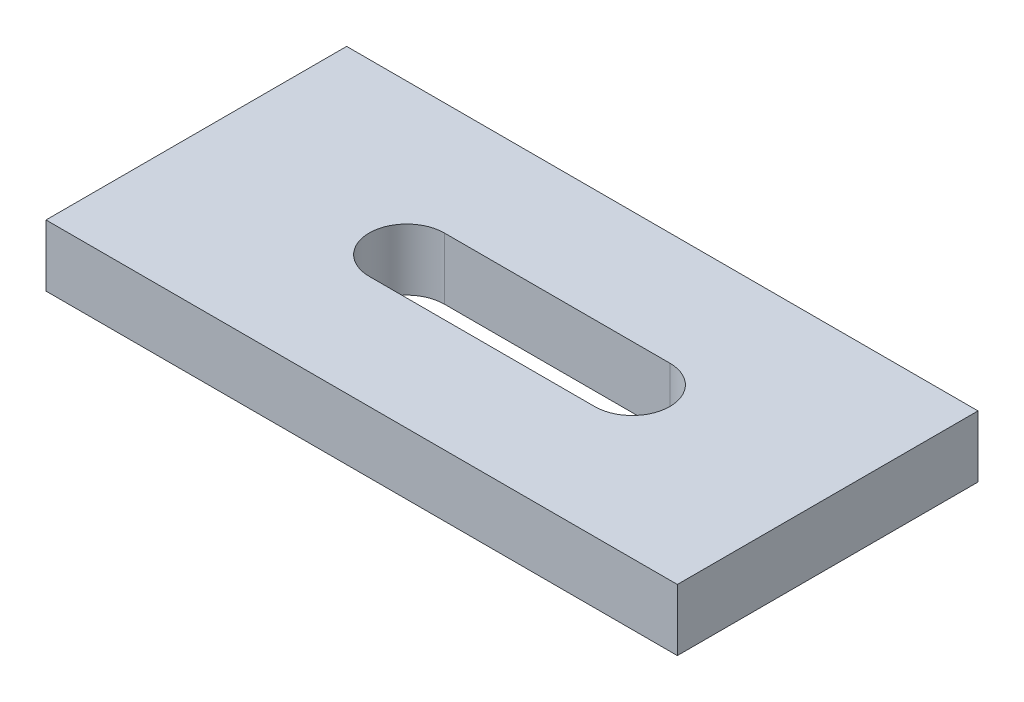
ISO-10303-21;
HEADER;
FILE_DESCRIPTION(('STEP AP214'),'2;1');
FILE_NAME('part.step','',(''),(''),'','','');
FILE_SCHEMA(('AUTOMOTIVE_DESIGN { 1 0 10303 214 1 1 1 1 }'));
ENDSEC;
DATA;
#1=APPLICATION_CONTEXT('core data for automotive mechanical design processes');
#2=APPLICATION_PROTOCOL_DEFINITION('international standard','automotive_design',2000,#1);
#3=PRODUCT_CONTEXT('',#1,'mechanical');
#4=PRODUCT('Part','Part','',(#3));
#5=PRODUCT_RELATED_PRODUCT_CATEGORY('part','',(#4));
#6=PRODUCT_DEFINITION_FORMATION('','',#4);
#7=PRODUCT_DEFINITION_CONTEXT('part definition',#1,'design');
#8=PRODUCT_DEFINITION('design','',#6,#7);
#9=PRODUCT_DEFINITION_SHAPE('','',#8);
#10=(LENGTH_UNIT() NAMED_UNIT(*) SI_UNIT(.MILLI.,.METRE.));
#11=(NAMED_UNIT(*) PLANE_ANGLE_UNIT() SI_UNIT($,.RADIAN.));
#12=(NAMED_UNIT(*) SI_UNIT($,.STERADIAN.) SOLID_ANGLE_UNIT());
#13=UNCERTAINTY_MEASURE_WITH_UNIT(LENGTH_MEASURE(1.E-05),#10,'distance_accuracy_value','');
#14=(GEOMETRIC_REPRESENTATION_CONTEXT(3) GLOBAL_UNCERTAINTY_ASSIGNED_CONTEXT((#13)) GLOBAL_UNIT_ASSIGNED_CONTEXT((#10,
#11,#12)) REPRESENTATION_CONTEXT('',''));
#15=CARTESIAN_POINT('',(0.,0.,0.));
#16=DIRECTION('',(0.,0.,1.));
#17=DIRECTION('',(1.,0.,0.));
#18=AXIS2_PLACEMENT_3D('',#15,#16,#17);
#19=CARTESIAN_POINT('',(0.,4.1,0.));
#20=DIRECTION('',(1.,0.,0.));
#21=DIRECTION('',(0.,0.,-1.));
#22=AXIS2_PLACEMENT_3D('',#19,#20,#21);
#23=PLANE('',#22);
#24=DIRECTION('',(0.,0.,1.));
#25=VECTOR('',#24,1.);
#26=CARTESIAN_POINT('',(0.,0.,0.));
#27=LINE('',#26,#25);
#28=CARTESIAN_POINT('',(0.,0.,-20.));
#29=VERTEX_POINT('',#28);
#30=CARTESIAN_POINT('',(0.,0.,0.));
#31=VERTEX_POINT('',#30);
#32=EDGE_CURVE('E126',#29,#31,#27,.T.);
#33=ORIENTED_EDGE('',*,*,#32,.T.);
#34=DIRECTION('',(0.,-1.,0.));
#35=VECTOR('',#34,1.);
#36=CARTESIAN_POINT('',(0.,4.1,0.));
#37=LINE('',#36,#35);
#38=CARTESIAN_POINT('',(0.,4.1,0.));
#39=VERTEX_POINT('',#38);
#40=EDGE_CURVE('E155',#39,#31,#37,.T.);
#41=ORIENTED_EDGE('',*,*,#40,.F.);
#42=DIRECTION('',(0.,0.,1.));
#43=VECTOR('',#42,1.);
#44=CARTESIAN_POINT('',(0.,4.1,0.));
#45=LINE('',#44,#43);
#46=CARTESIAN_POINT('',(0.,4.1,-20.));
#47=VERTEX_POINT('',#46);
#48=EDGE_CURVE('E129',#47,#39,#45,.T.);
#49=ORIENTED_EDGE('',*,*,#48,.F.);
#50=DIRECTION('',(0.,-1.,0.));
#51=VECTOR('',#50,1.);
#52=CARTESIAN_POINT('',(0.,4.1,-20.));
#53=LINE('',#52,#51);
#54=EDGE_CURVE('E139',#47,#29,#53,.T.);
#55=ORIENTED_EDGE('',*,*,#54,.T.);
#56=EDGE_LOOP('',(#33,#41,#49,#55));
#57=FACE_BOUND('',#56,.T.);
#58=ADVANCED_FACE('F37',(#57),#23,.F.);
#59=CARTESIAN_POINT('',(0.,4.1,0.));
#60=DIRECTION('',(0.,0.,-1.));
#61=DIRECTION('',(-1.,0.,0.));
#62=AXIS2_PLACEMENT_3D('',#59,#60,#61);
#63=PLANE('',#62);
#64=DIRECTION('',(1.,0.,0.));
#65=VECTOR('',#64,1.);
#66=CARTESIAN_POINT('',(0.,0.,0.));
#67=LINE('',#66,#65);
#68=CARTESIAN_POINT('',(42.,0.,0.));
#69=VERTEX_POINT('',#68);
#70=EDGE_CURVE('E142',#31,#69,#67,.T.);
#71=ORIENTED_EDGE('',*,*,#70,.T.);
#72=DIRECTION('',(0.,-1.,0.));
#73=VECTOR('',#72,1.);
#74=CARTESIAN_POINT('',(42.,4.1,0.));
#75=LINE('',#74,#73);
#76=CARTESIAN_POINT('',(42.,4.1,0.));
#77=VERTEX_POINT('',#76);
#78=EDGE_CURVE('E152',#77,#69,#75,.T.);
#79=ORIENTED_EDGE('',*,*,#78,.F.);
#80=DIRECTION('',(1.,0.,0.));
#81=VECTOR('',#80,1.);
#82=CARTESIAN_POINT('',(0.,4.1,0.));
#83=LINE('',#82,#81);
#84=EDGE_CURVE('E132',#39,#77,#83,.T.);
#85=ORIENTED_EDGE('',*,*,#84,.F.);
#86=ORIENTED_EDGE('',*,*,#40,.T.);
#87=EDGE_LOOP('',(#71,#79,#85,#86));
#88=FACE_BOUND('',#87,.T.);
#89=ADVANCED_FACE('F180',(#88),#63,.F.);
#90=CARTESIAN_POINT('',(42.,4.1,0.));
#91=DIRECTION('',(-1.,0.,0.));
#92=DIRECTION('',(0.,0.,1.));
#93=AXIS2_PLACEMENT_3D('',#90,#91,#92);
#94=PLANE('',#93);
#95=DIRECTION('',(0.,0.,-1.));
#96=VECTOR('',#95,1.);
#97=CARTESIAN_POINT('',(42.,0.,0.));
#98=LINE('',#97,#96);
#99=CARTESIAN_POINT('',(42.,0.,-20.));
#100=VERTEX_POINT('',#99);
#101=EDGE_CURVE('E144',#69,#100,#98,.T.);
#102=ORIENTED_EDGE('',*,*,#101,.T.);
#103=DIRECTION('',(0.,-1.,0.));
#104=VECTOR('',#103,1.);
#105=CARTESIAN_POINT('',(42.,4.1,-20.));
#106=LINE('',#105,#104);
#107=CARTESIAN_POINT('',(42.,4.1,-20.));
#108=VERTEX_POINT('',#107);
#109=EDGE_CURVE('E149',#108,#100,#106,.T.);
#110=ORIENTED_EDGE('',*,*,#109,.F.);
#111=DIRECTION('',(0.,0.,-1.));
#112=VECTOR('',#111,1.);
#113=CARTESIAN_POINT('',(42.,4.1,0.));
#114=LINE('',#113,#112);
#115=EDGE_CURVE('E135',#77,#108,#114,.T.);
#116=ORIENTED_EDGE('',*,*,#115,.F.);
#117=ORIENTED_EDGE('',*,*,#78,.T.);
#118=EDGE_LOOP('',(#102,#110,#116,#117));
#119=FACE_BOUND('',#118,.T.);
#120=ADVANCED_FACE('F185',(#119),#94,.F.);
#121=CARTESIAN_POINT('',(0.,4.1,-20.));
#122=DIRECTION('',(0.,0.,1.));
#123=DIRECTION('',(1.,0.,0.));
#124=AXIS2_PLACEMENT_3D('',#121,#122,#123);
#125=PLANE('',#124);
#126=DIRECTION('',(-1.,0.,0.));
#127=VECTOR('',#126,1.);
#128=CARTESIAN_POINT('',(0.,0.,-20.));
#129=LINE('',#128,#127);
#130=EDGE_CURVE('E133',#100,#29,#129,.T.);
#131=ORIENTED_EDGE('',*,*,#130,.T.);
#132=ORIENTED_EDGE('',*,*,#54,.F.);
#133=DIRECTION('',(-1.,0.,0.));
#134=VECTOR('',#133,1.);
#135=CARTESIAN_POINT('',(0.,4.1,-20.));
#136=LINE('',#135,#134);
#137=EDGE_CURVE('E137',#108,#47,#136,.T.);
#138=ORIENTED_EDGE('',*,*,#137,.F.);
#139=ORIENTED_EDGE('',*,*,#109,.T.);
#140=EDGE_LOOP('',(#131,#132,#138,#139));
#141=FACE_BOUND('',#140,.T.);
#142=ADVANCED_FACE('F198',(#141),#125,.F.);
#143=CARTESIAN_POINT('',(0.,4.1,0.));
#144=DIRECTION('',(0.,-1.,0.));
#145=DIRECTION('',(0.,0.,-1.));
#146=AXIS2_PLACEMENT_3D('',#143,#144,#145);
#147=PLANE('',#146);
#148=DIRECTION('',(-1.,0.,0.));
#149=VECTOR('',#148,1.);
#150=CARTESIAN_POINT('',(29.,4.1,-12.5));
#151=LINE('',#150,#149);
#152=CARTESIAN_POINT('',(29.,4.1,-12.5));
#153=VERTEX_POINT('',#152);
#154=CARTESIAN_POINT('',(14.,4.1,-12.5));
#155=VERTEX_POINT('',#154);
#156=EDGE_CURVE('E112',#153,#155,#151,.T.);
#157=ORIENTED_EDGE('',*,*,#156,.F.);
#158=CARTESIAN_POINT('',(29.,4.1,-10.));
#159=DIRECTION('',(0.,1.,0.));
#160=DIRECTION('',(0.,0.,1.));
#161=AXIS2_PLACEMENT_3D('',#158,#159,#160);
#162=CIRCLE('',#161,2.5);
#163=CARTESIAN_POINT('',(29.,4.1,-7.50000000000001));
#164=VERTEX_POINT('',#163);
#165=EDGE_CURVE('E51',#164,#153,#162,.T.);
#166=ORIENTED_EDGE('',*,*,#165,.F.);
#167=DIRECTION('',(1.,0.,0.));
#168=VECTOR('',#167,1.);
#169=CARTESIAN_POINT('',(14.,4.1,-7.5));
#170=LINE('',#169,#168);
#171=CARTESIAN_POINT('',(14.,4.1,-7.5));
#172=VERTEX_POINT('',#171);
#173=EDGE_CURVE('E119',#172,#164,#170,.T.);
#174=ORIENTED_EDGE('',*,*,#173,.F.);
#175=CARTESIAN_POINT('',(14.,4.1,-10.));
#176=DIRECTION('',(0.,1.,0.));
#177=DIRECTION('',(0.,0.,1.));
#178=AXIS2_PLACEMENT_3D('',#175,#176,#177);
#179=CIRCLE('',#178,2.5);
#180=EDGE_CURVE('E103',#155,#172,#179,.T.);
#181=ORIENTED_EDGE('',*,*,#180,.F.);
#182=EDGE_LOOP('',(#157,#166,#174,#181));
#183=FACE_BOUND('',#182,.T.);
#184=ORIENTED_EDGE('',*,*,#48,.T.);
#185=ORIENTED_EDGE('',*,*,#84,.T.);
#186=ORIENTED_EDGE('',*,*,#115,.T.);
#187=ORIENTED_EDGE('',*,*,#137,.T.);
#188=EDGE_LOOP('',(#184,#185,#186,#187));
#189=FACE_BOUND('',#188,.T.);
#190=ADVANCED_FACE('F116',(#183,#189),#147,.F.);
#191=CARTESIAN_POINT('',(0.,0.,0.));
#192=DIRECTION('',(0.,-1.,0.));
#193=DIRECTION('',(0.,0.,-1.));
#194=AXIS2_PLACEMENT_3D('',#191,#192,#193);
#195=PLANE('',#194);
#196=CARTESIAN_POINT('',(29.,0.,-10.));
#197=DIRECTION('',(0.,-1.,0.));
#198=DIRECTION('',(0.,0.,-1.));
#199=AXIS2_PLACEMENT_3D('',#196,#197,#198);
#200=CIRCLE('',#199,2.5);
#201=CARTESIAN_POINT('',(29.,0.,-12.5));
#202=VERTEX_POINT('',#201);
#203=CARTESIAN_POINT('',(29.,0.,-7.50000000000001));
#204=VERTEX_POINT('',#203);
#205=EDGE_CURVE('E11',#202,#204,#200,.T.);
#206=ORIENTED_EDGE('',*,*,#205,.F.);
#207=DIRECTION('',(1.,0.,0.));
#208=VECTOR('',#207,1.);
#209=CARTESIAN_POINT('',(0.,0.,-12.5));
#210=LINE('',#209,#208);
#211=CARTESIAN_POINT('',(14.,0.,-12.5));
#212=VERTEX_POINT('',#211);
#213=EDGE_CURVE('E158',#212,#202,#210,.T.);
#214=ORIENTED_EDGE('',*,*,#213,.F.);
#215=CARTESIAN_POINT('',(14.,0.,-10.));
#216=DIRECTION('',(0.,-1.,0.));
#217=DIRECTION('',(0.,0.,-1.));
#218=AXIS2_PLACEMENT_3D('',#215,#216,#217);
#219=CIRCLE('',#218,2.5);
#220=CARTESIAN_POINT('',(14.,0.,-7.5));
#221=VERTEX_POINT('',#220);
#222=EDGE_CURVE('E106',#221,#212,#219,.T.);
#223=ORIENTED_EDGE('',*,*,#222,.F.);
#224=DIRECTION('',(-1.,0.,0.));
#225=VECTOR('',#224,1.);
#226=CARTESIAN_POINT('',(0.,0.,-7.5));
#227=LINE('',#226,#225);
#228=EDGE_CURVE('E44',#204,#221,#227,.T.);
#229=ORIENTED_EDGE('',*,*,#228,.F.);
#230=EDGE_LOOP('',(#206,#214,#223,#229));
#231=FACE_BOUND('',#230,.T.);
#232=ORIENTED_EDGE('',*,*,#32,.F.);
#233=ORIENTED_EDGE('',*,*,#130,.F.);
#234=ORIENTED_EDGE('',*,*,#101,.F.);
#235=ORIENTED_EDGE('',*,*,#70,.F.);
#236=EDGE_LOOP('',(#232,#233,#234,#235));
#237=FACE_BOUND('',#236,.T.);
#238=ADVANCED_FACE('F166',(#231,#237),#195,.T.);
#239=CARTESIAN_POINT('',(29.,-5.9,-10.));
#240=DIRECTION('',(0.,1.,0.));
#241=DIRECTION('',(0.,0.,1.));
#242=AXIS2_PLACEMENT_3D('',#239,#240,#241);
#243=CYLINDRICAL_SURFACE('',#242,2.5);
#244=ORIENTED_EDGE('',*,*,#205,.T.);
#245=DIRECTION('',(0.,1.,0.));
#246=VECTOR('',#245,1.);
#247=CARTESIAN_POINT('',(29.,-5.9,-7.50000000000001));
#248=LINE('',#247,#246);
#249=EDGE_CURVE('E124',#204,#164,#248,.T.);
#250=ORIENTED_EDGE('',*,*,#249,.T.);
#251=ORIENTED_EDGE('',*,*,#165,.T.);
#252=DIRECTION('',(0.,1.,0.));
#253=VECTOR('',#252,1.);
#254=CARTESIAN_POINT('',(29.,-5.9,-12.5));
#255=LINE('',#254,#253);
#256=EDGE_CURVE('E109',#202,#153,#255,.T.);
#257=ORIENTED_EDGE('',*,*,#256,.F.);
#258=EDGE_LOOP('',(#244,#250,#251,#257));
#259=FACE_BOUND('',#258,.T.);
#260=ADVANCED_FACE('F168',(#259),#243,.F.);
#261=CARTESIAN_POINT('',(14.,-5.9,-7.5));
#262=DIRECTION('',(0.,0.,1.));
#263=DIRECTION('',(1.,0.,0.));
#264=AXIS2_PLACEMENT_3D('',#261,#262,#263);
#265=PLANE('',#264);
#266=ORIENTED_EDGE('',*,*,#228,.T.);
#267=DIRECTION('',(0.,1.,0.));
#268=VECTOR('',#267,1.);
#269=CARTESIAN_POINT('',(14.,-5.9,-7.5));
#270=LINE('',#269,#268);
#271=EDGE_CURVE('E108',#221,#172,#270,.T.);
#272=ORIENTED_EDGE('',*,*,#271,.T.);
#273=ORIENTED_EDGE('',*,*,#173,.T.);
#274=ORIENTED_EDGE('',*,*,#249,.F.);
#275=EDGE_LOOP('',(#266,#272,#273,#274));
#276=FACE_BOUND('',#275,.T.);
#277=ADVANCED_FACE('F163',(#276),#265,.F.);
#278=CARTESIAN_POINT('',(14.,-5.9,-10.));
#279=DIRECTION('',(0.,1.,0.));
#280=DIRECTION('',(0.,0.,1.));
#281=AXIS2_PLACEMENT_3D('',#278,#279,#280);
#282=CYLINDRICAL_SURFACE('',#281,2.5);
#283=ORIENTED_EDGE('',*,*,#222,.T.);
#284=DIRECTION('',(0.,1.,0.));
#285=VECTOR('',#284,1.);
#286=CARTESIAN_POINT('',(14.,-5.9,-12.5));
#287=LINE('',#286,#285);
#288=EDGE_CURVE('E59',#212,#155,#287,.T.);
#289=ORIENTED_EDGE('',*,*,#288,.T.);
#290=ORIENTED_EDGE('',*,*,#180,.T.);
#291=ORIENTED_EDGE('',*,*,#271,.F.);
#292=EDGE_LOOP('',(#283,#289,#290,#291));
#293=FACE_BOUND('',#292,.T.);
#294=ADVANCED_FACE('F100',(#293),#282,.F.);
#295=CARTESIAN_POINT('',(29.,-5.9,-12.5));
#296=DIRECTION('',(0.,0.,-1.));
#297=DIRECTION('',(-1.,0.,0.));
#298=AXIS2_PLACEMENT_3D('',#295,#296,#297);
#299=PLANE('',#298);
#300=ORIENTED_EDGE('',*,*,#213,.T.);
#301=ORIENTED_EDGE('',*,*,#256,.T.);
#302=ORIENTED_EDGE('',*,*,#156,.T.);
#303=ORIENTED_EDGE('',*,*,#288,.F.);
#304=EDGE_LOOP('',(#300,#301,#302,#303));
#305=FACE_BOUND('',#304,.T.);
#306=ADVANCED_FACE('F113',(#305),#299,.F.);
#307=CLOSED_SHELL('',(#58,#89,#120,#142,#190,#238,#260,#277,#294,#306));
#308=MANIFOLD_SOLID_BREP('B2',#307);
#309=ADVANCED_BREP_SHAPE_REPRESENTATION('',(#18,#308),#14);
#310=SHAPE_DEFINITION_REPRESENTATION(#9,#309);
ENDSEC;
END-ISO-10303-21;
